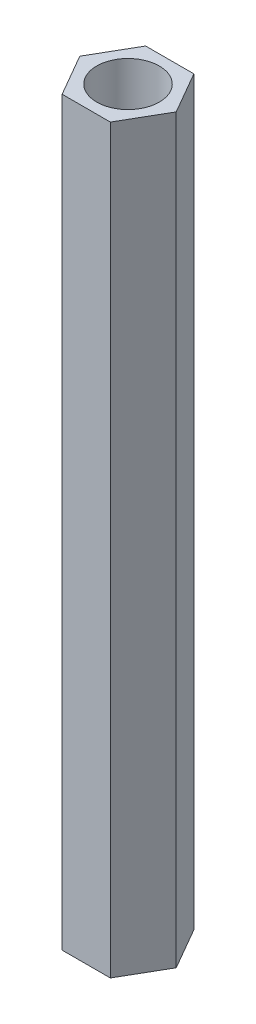
ISO-10303-21;
HEADER;
FILE_DESCRIPTION(('STEP AP214'),'2;1');
FILE_NAME('part.step','',(''),(''),'','','');
FILE_SCHEMA(('AUTOMOTIVE_DESIGN { 1 0 10303 214 1 1 1 1 }'));
ENDSEC;
DATA;
#1=APPLICATION_CONTEXT('core data for automotive mechanical design processes');
#2=APPLICATION_PROTOCOL_DEFINITION('international standard','automotive_design',2000,#1);
#3=PRODUCT_CONTEXT('',#1,'mechanical');
#4=PRODUCT('Part','Part','',(#3));
#5=PRODUCT_RELATED_PRODUCT_CATEGORY('part','',(#4));
#6=PRODUCT_DEFINITION_FORMATION('','',#4);
#7=PRODUCT_DEFINITION_CONTEXT('part definition',#1,'design');
#8=PRODUCT_DEFINITION('design','',#6,#7);
#9=PRODUCT_DEFINITION_SHAPE('','',#8);
#10=(LENGTH_UNIT() NAMED_UNIT(*) SI_UNIT(.MILLI.,.METRE.));
#11=(NAMED_UNIT(*) PLANE_ANGLE_UNIT() SI_UNIT($,.RADIAN.));
#12=(NAMED_UNIT(*) SI_UNIT($,.STERADIAN.) SOLID_ANGLE_UNIT());
#13=UNCERTAINTY_MEASURE_WITH_UNIT(LENGTH_MEASURE(1.E-05),#10,'distance_accuracy_value','');
#14=(GEOMETRIC_REPRESENTATION_CONTEXT(3) GLOBAL_UNCERTAINTY_ASSIGNED_CONTEXT((#13)) GLOBAL_UNIT_ASSIGNED_CONTEXT((#10,
#11,#12)) REPRESENTATION_CONTEXT('',''));
#15=CARTESIAN_POINT('',(0.,0.,0.));
#16=DIRECTION('',(0.,0.,1.));
#17=DIRECTION('',(1.,0.,0.));
#18=AXIS2_PLACEMENT_3D('',#15,#16,#17);
#19=CARTESIAN_POINT('',(0.,71.,0.));
#20=DIRECTION('',(0.,1.,0.));
#21=DIRECTION('',(0.,0.,1.));
#22=AXIS2_PLACEMENT_3D('',#19,#20,#21);
#23=PLANE('',#22);
#24=DIRECTION('',(0.5,0.,-0.866025403784439));
#25=VECTOR('',#24,1.);
#26=CARTESIAN_POINT('',(2.3094010767585,71.,4.));
#27=LINE('',#26,#25);
#28=CARTESIAN_POINT('',(2.3094010767585,71.,4.));
#29=VERTEX_POINT('',#28);
#30=CARTESIAN_POINT('',(4.61880215351701,71.,0.));
#31=VERTEX_POINT('',#30);
#32=EDGE_CURVE('E131',#29,#31,#27,.T.);
#33=ORIENTED_EDGE('',*,*,#32,.T.);
#34=DIRECTION('',(-0.5,0.,-0.866025403784439));
#35=VECTOR('',#34,1.);
#36=CARTESIAN_POINT('',(4.61880215351701,71.,0.));
#37=LINE('',#36,#35);
#38=CARTESIAN_POINT('',(2.3094010767585,71.,-4.));
#39=VERTEX_POINT('',#38);
#40=EDGE_CURVE('E89',#31,#39,#37,.T.);
#41=ORIENTED_EDGE('',*,*,#40,.T.);
#42=DIRECTION('',(-1.,0.,0.));
#43=VECTOR('',#42,1.);
#44=CARTESIAN_POINT('',(2.3094010767585,71.,-4.));
#45=LINE('',#44,#43);
#46=CARTESIAN_POINT('',(-2.3094010767585,71.,-4.));
#47=VERTEX_POINT('',#46);
#48=EDGE_CURVE('E102',#39,#47,#45,.T.);
#49=ORIENTED_EDGE('',*,*,#48,.T.);
#50=DIRECTION('',(-0.5,0.,0.866025403784439));
#51=VECTOR('',#50,1.);
#52=CARTESIAN_POINT('',(-2.3094010767585,71.,-4.));
#53=LINE('',#52,#51);
#54=CARTESIAN_POINT('',(-4.61880215351701,71.,0.));
#55=VERTEX_POINT('',#54);
#56=EDGE_CURVE('E96',#47,#55,#53,.T.);
#57=ORIENTED_EDGE('',*,*,#56,.T.);
#58=DIRECTION('',(0.5,0.,0.866025403784439));
#59=VECTOR('',#58,1.);
#60=CARTESIAN_POINT('',(-4.61880215351701,71.,0.));
#61=LINE('',#60,#59);
#62=CARTESIAN_POINT('',(-2.3094010767585,71.,4.));
#63=VERTEX_POINT('',#62);
#64=EDGE_CURVE('E100',#55,#63,#61,.T.);
#65=ORIENTED_EDGE('',*,*,#64,.T.);
#66=DIRECTION('',(1.,0.,0.));
#67=VECTOR('',#66,1.);
#68=CARTESIAN_POINT('',(-2.3094010767585,71.,4.));
#69=LINE('',#68,#67);
#70=EDGE_CURVE('E52',#63,#29,#69,.T.);
#71=ORIENTED_EDGE('',*,*,#70,.T.);
#72=EDGE_LOOP('',(#33,#41,#49,#57,#65,#71));
#73=FACE_BOUND('',#72,.T.);
#74=CARTESIAN_POINT('',(0.,71.,0.));
#75=DIRECTION('',(0.,1.,0.));
#76=DIRECTION('',(0.,0.,1.));
#77=AXIS2_PLACEMENT_3D('',#74,#75,#76);
#78=CIRCLE('',#77,3.);
#79=CARTESIAN_POINT('',(0.,71.,3.));
#80=VERTEX_POINT('',#79);
#81=EDGE_CURVE('E124',#80,#80,#78,.T.);
#82=ORIENTED_EDGE('',*,*,#81,.F.);
#83=EDGE_LOOP('',(#82));
#84=FACE_BOUND('',#83,.T.);
#85=ADVANCED_FACE('F35',(#73,#84),#23,.T.);
#86=CARTESIAN_POINT('',(0.,0.,0.));
#87=DIRECTION('',(0.,1.,0.));
#88=DIRECTION('',(0.,0.,1.));
#89=AXIS2_PLACEMENT_3D('',#86,#87,#88);
#90=PLANE('',#89);
#91=DIRECTION('',(0.5,0.,-0.866025403784439));
#92=VECTOR('',#91,1.);
#93=CARTESIAN_POINT('',(2.3094010767585,0.,4.));
#94=LINE('',#93,#92);
#95=CARTESIAN_POINT('',(2.3094010767585,0.,4.));
#96=VERTEX_POINT('',#95);
#97=CARTESIAN_POINT('',(4.61880215351701,0.,0.));
#98=VERTEX_POINT('',#97);
#99=EDGE_CURVE('E120',#96,#98,#94,.T.);
#100=ORIENTED_EDGE('',*,*,#99,.F.);
#101=DIRECTION('',(1.,0.,0.));
#102=VECTOR('',#101,1.);
#103=CARTESIAN_POINT('',(-2.3094010767585,0.,4.));
#104=LINE('',#103,#102);
#105=CARTESIAN_POINT('',(-2.3094010767585,0.,4.));
#106=VERTEX_POINT('',#105);
#107=EDGE_CURVE('E81',#106,#96,#104,.T.);
#108=ORIENTED_EDGE('',*,*,#107,.F.);
#109=DIRECTION('',(0.5,0.,0.866025403784439));
#110=VECTOR('',#109,1.);
#111=CARTESIAN_POINT('',(-4.61880215351701,0.,0.));
#112=LINE('',#111,#110);
#113=CARTESIAN_POINT('',(-4.61880215351701,0.,0.));
#114=VERTEX_POINT('',#113);
#115=EDGE_CURVE('E75',#114,#106,#112,.T.);
#116=ORIENTED_EDGE('',*,*,#115,.F.);
#117=DIRECTION('',(-0.5,0.,0.866025403784439));
#118=VECTOR('',#117,1.);
#119=CARTESIAN_POINT('',(-2.3094010767585,0.,-4.));
#120=LINE('',#119,#118);
#121=CARTESIAN_POINT('',(-2.3094010767585,0.,-4.));
#122=VERTEX_POINT('',#121);
#123=EDGE_CURVE('E110',#122,#114,#120,.T.);
#124=ORIENTED_EDGE('',*,*,#123,.F.);
#125=DIRECTION('',(-1.,0.,0.));
#126=VECTOR('',#125,1.);
#127=CARTESIAN_POINT('',(2.3094010767585,0.,-4.));
#128=LINE('',#127,#126);
#129=CARTESIAN_POINT('',(2.3094010767585,0.,-4.));
#130=VERTEX_POINT('',#129);
#131=EDGE_CURVE('E126',#130,#122,#128,.T.);
#132=ORIENTED_EDGE('',*,*,#131,.F.);
#133=DIRECTION('',(-0.5,0.,-0.866025403784439));
#134=VECTOR('',#133,1.);
#135=CARTESIAN_POINT('',(4.61880215351701,0.,0.));
#136=LINE('',#135,#134);
#137=EDGE_CURVE('E123',#98,#130,#136,.T.);
#138=ORIENTED_EDGE('',*,*,#137,.F.);
#139=EDGE_LOOP('',(#100,#108,#116,#124,#132,#138));
#140=FACE_BOUND('',#139,.T.);
#141=CARTESIAN_POINT('',(0.,0.,0.));
#142=DIRECTION('',(0.,1.,0.));
#143=DIRECTION('',(0.,0.,1.));
#144=AXIS2_PLACEMENT_3D('',#141,#142,#143);
#145=CIRCLE('',#144,3.);
#146=CARTESIAN_POINT('',(0.,0.,3.));
#147=VERTEX_POINT('',#146);
#148=EDGE_CURVE('E224',#147,#147,#145,.T.);
#149=ORIENTED_EDGE('',*,*,#148,.T.);
#150=EDGE_LOOP('',(#149));
#151=FACE_BOUND('',#150,.T.);
#152=ADVANCED_FACE('F140',(#140,#151),#90,.F.);
#153=CARTESIAN_POINT('',(2.3094010767585,71.,4.));
#154=DIRECTION('',(-0.866025403784439,0.,-0.5));
#155=DIRECTION('',(-0.5,0.,0.866025403784439));
#156=AXIS2_PLACEMENT_3D('',#153,#154,#155);
#157=PLANE('',#156);
#158=ORIENTED_EDGE('',*,*,#99,.T.);
#159=DIRECTION('',(0.,-1.,0.));
#160=VECTOR('',#159,1.);
#161=CARTESIAN_POINT('',(4.61880215351701,71.,0.));
#162=LINE('',#161,#160);
#163=EDGE_CURVE('E11',#31,#98,#162,.T.);
#164=ORIENTED_EDGE('',*,*,#163,.F.);
#165=ORIENTED_EDGE('',*,*,#32,.F.);
#166=DIRECTION('',(0.,-1.,0.));
#167=VECTOR('',#166,1.);
#168=CARTESIAN_POINT('',(2.3094010767585,71.,4.));
#169=LINE('',#168,#167);
#170=EDGE_CURVE('E116',#29,#96,#169,.T.);
#171=ORIENTED_EDGE('',*,*,#170,.T.);
#172=EDGE_LOOP('',(#158,#164,#165,#171));
#173=FACE_BOUND('',#172,.T.);
#174=ADVANCED_FACE('F37',(#173),#157,.F.);
#175=CARTESIAN_POINT('',(4.61880215351701,71.,0.));
#176=DIRECTION('',(-0.866025403784439,0.,0.5));
#177=DIRECTION('',(0.5,0.,0.866025403784439));
#178=AXIS2_PLACEMENT_3D('',#175,#176,#177);
#179=PLANE('',#178);
#180=ORIENTED_EDGE('',*,*,#137,.T.);
#181=DIRECTION('',(0.,-1.,0.));
#182=VECTOR('',#181,1.);
#183=CARTESIAN_POINT('',(2.3094010767585,71.,-4.));
#184=LINE('',#183,#182);
#185=EDGE_CURVE('E44',#39,#130,#184,.T.);
#186=ORIENTED_EDGE('',*,*,#185,.F.);
#187=ORIENTED_EDGE('',*,*,#40,.F.);
#188=ORIENTED_EDGE('',*,*,#163,.T.);
#189=EDGE_LOOP('',(#180,#186,#187,#188));
#190=FACE_BOUND('',#189,.T.);
#191=ADVANCED_FACE('F165',(#190),#179,.F.);
#192=CARTESIAN_POINT('',(2.3094010767585,71.,-4.));
#193=DIRECTION('',(0.,0.,1.));
#194=DIRECTION('',(1.,0.,0.));
#195=AXIS2_PLACEMENT_3D('',#192,#193,#194);
#196=PLANE('',#195);
#197=ORIENTED_EDGE('',*,*,#131,.T.);
#198=DIRECTION('',(0.,-1.,0.));
#199=VECTOR('',#198,1.);
#200=CARTESIAN_POINT('',(-2.3094010767585,71.,-4.));
#201=LINE('',#200,#199);
#202=EDGE_CURVE('E111',#47,#122,#201,.T.);
#203=ORIENTED_EDGE('',*,*,#202,.F.);
#204=ORIENTED_EDGE('',*,*,#48,.F.);
#205=ORIENTED_EDGE('',*,*,#185,.T.);
#206=EDGE_LOOP('',(#197,#203,#204,#205));
#207=FACE_BOUND('',#206,.T.);
#208=ADVANCED_FACE('F137',(#207),#196,.F.);
#209=CARTESIAN_POINT('',(-2.3094010767585,71.,-4.));
#210=DIRECTION('',(0.866025403784439,0.,0.5));
#211=DIRECTION('',(0.5,0.,-0.866025403784439));
#212=AXIS2_PLACEMENT_3D('',#209,#210,#211);
#213=PLANE('',#212);
#214=ORIENTED_EDGE('',*,*,#123,.T.);
#215=DIRECTION('',(0.,-1.,0.));
#216=VECTOR('',#215,1.);
#217=CARTESIAN_POINT('',(-4.61880215351701,71.,0.));
#218=LINE('',#217,#216);
#219=EDGE_CURVE('E107',#55,#114,#218,.T.);
#220=ORIENTED_EDGE('',*,*,#219,.F.);
#221=ORIENTED_EDGE('',*,*,#56,.F.);
#222=ORIENTED_EDGE('',*,*,#202,.T.);
#223=EDGE_LOOP('',(#214,#220,#221,#222));
#224=FACE_BOUND('',#223,.T.);
#225=ADVANCED_FACE('F108',(#224),#213,.F.);
#226=CARTESIAN_POINT('',(-4.61880215351701,71.,0.));
#227=DIRECTION('',(0.866025403784439,0.,-0.5));
#228=DIRECTION('',(-0.5,0.,-0.866025403784439));
#229=AXIS2_PLACEMENT_3D('',#226,#227,#228);
#230=PLANE('',#229);
#231=ORIENTED_EDGE('',*,*,#115,.T.);
#232=DIRECTION('',(0.,-1.,0.));
#233=VECTOR('',#232,1.);
#234=CARTESIAN_POINT('',(-2.3094010767585,71.,4.));
#235=LINE('',#234,#233);
#236=EDGE_CURVE('E112',#63,#106,#235,.T.);
#237=ORIENTED_EDGE('',*,*,#236,.F.);
#238=ORIENTED_EDGE('',*,*,#64,.F.);
#239=ORIENTED_EDGE('',*,*,#219,.T.);
#240=EDGE_LOOP('',(#231,#237,#238,#239));
#241=FACE_BOUND('',#240,.T.);
#242=ADVANCED_FACE('F114',(#241),#230,.F.);
#243=CARTESIAN_POINT('',(-2.3094010767585,71.,4.));
#244=DIRECTION('',(0.,0.,-1.));
#245=DIRECTION('',(-1.,0.,0.));
#246=AXIS2_PLACEMENT_3D('',#243,#244,#245);
#247=PLANE('',#246);
#248=ORIENTED_EDGE('',*,*,#107,.T.);
#249=ORIENTED_EDGE('',*,*,#170,.F.);
#250=ORIENTED_EDGE('',*,*,#70,.F.);
#251=ORIENTED_EDGE('',*,*,#236,.T.);
#252=EDGE_LOOP('',(#248,#249,#250,#251));
#253=FACE_BOUND('',#252,.T.);
#254=ADVANCED_FACE('F145',(#253),#247,.F.);
#255=CARTESIAN_POINT('',(0.,71.,0.));
#256=DIRECTION('',(0.,-1.,0.));
#257=DIRECTION('',(0.,0.,-1.));
#258=AXIS2_PLACEMENT_3D('',#255,#256,#257);
#259=CYLINDRICAL_SURFACE('',#258,3.);
#260=ORIENTED_EDGE('',*,*,#81,.T.);
#261=EDGE_LOOP('',(#260));
#262=FACE_BOUND('',#261,.T.);
#263=ORIENTED_EDGE('',*,*,#148,.F.);
#264=EDGE_LOOP('',(#263));
#265=FACE_BOUND('',#264,.T.);
#266=ADVANCED_FACE('F147',(#262,#265),#259,.F.);
#267=CLOSED_SHELL('',(#85,#152,#174,#191,#208,#225,#242,#254,#266));
#268=MANIFOLD_SOLID_BREP('B2',#267);
#269=ADVANCED_BREP_SHAPE_REPRESENTATION('',(#18,#268),#14);
#270=SHAPE_DEFINITION_REPRESENTATION(#9,#269);
ENDSEC;
END-ISO-10303-21;
